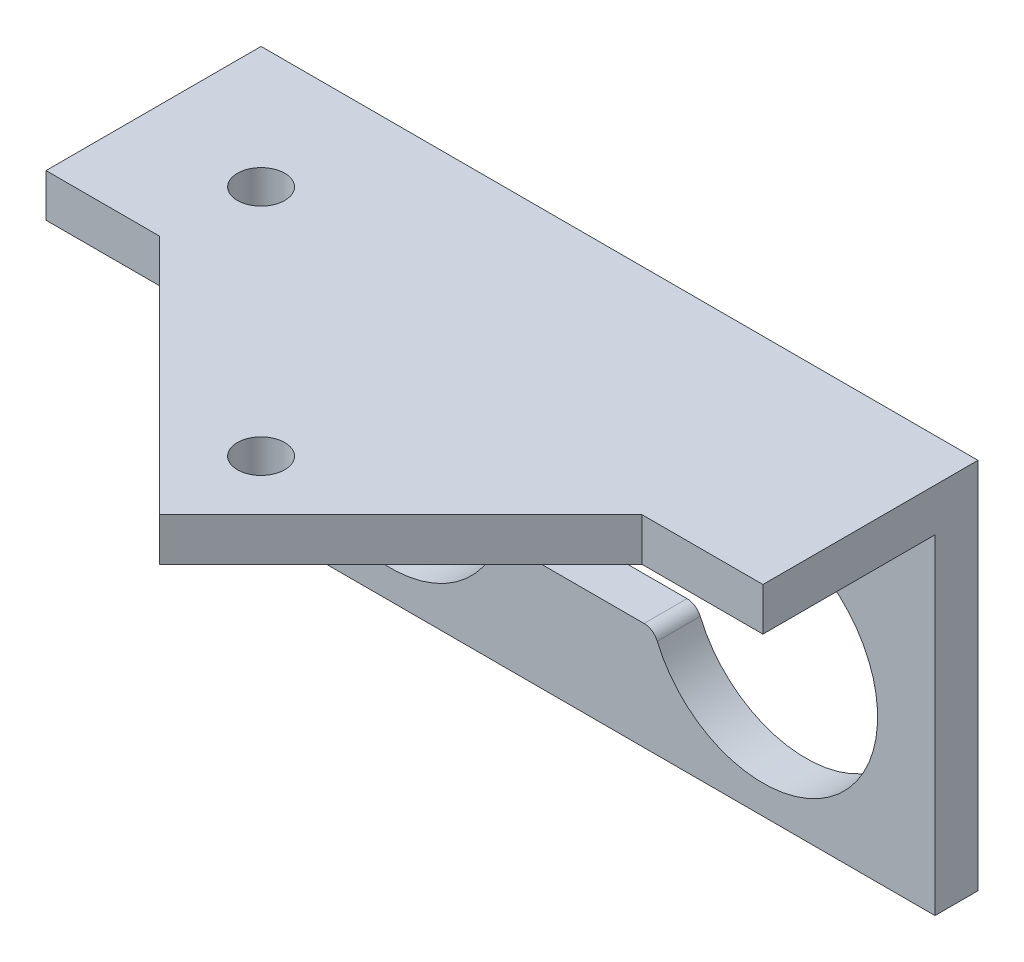
ISO-10303-21;
HEADER;
FILE_DESCRIPTION(('STEP AP214'),'2;1');
FILE_NAME('part.step','',(''),(''),'','','');
FILE_SCHEMA(('AUTOMOTIVE_DESIGN { 1 0 10303 214 1 1 1 1 }'));
ENDSEC;
DATA;
#1=APPLICATION_CONTEXT('core data for automotive mechanical design processes');
#2=APPLICATION_PROTOCOL_DEFINITION('international standard','automotive_design',2000,#1);
#3=PRODUCT_CONTEXT('',#1,'mechanical');
#4=PRODUCT('Part','Part','',(#3));
#5=PRODUCT_RELATED_PRODUCT_CATEGORY('part','',(#4));
#6=PRODUCT_DEFINITION_FORMATION('','',#4);
#7=PRODUCT_DEFINITION_CONTEXT('part definition',#1,'design');
#8=PRODUCT_DEFINITION('design','',#6,#7);
#9=PRODUCT_DEFINITION_SHAPE('','',#8);
#10=(LENGTH_UNIT() NAMED_UNIT(*) SI_UNIT(.MILLI.,.METRE.));
#11=(NAMED_UNIT(*) PLANE_ANGLE_UNIT() SI_UNIT($,.RADIAN.));
#12=(NAMED_UNIT(*) SI_UNIT($,.STERADIAN.) SOLID_ANGLE_UNIT());
#13=UNCERTAINTY_MEASURE_WITH_UNIT(LENGTH_MEASURE(1.E-05),#10,'distance_accuracy_value','');
#14=(GEOMETRIC_REPRESENTATION_CONTEXT(3) GLOBAL_UNCERTAINTY_ASSIGNED_CONTEXT((#13)) GLOBAL_UNIT_ASSIGNED_CONTEXT((#10,
#11,#12)) REPRESENTATION_CONTEXT('',''));
#15=CARTESIAN_POINT('',(0.,0.,0.));
#16=DIRECTION('',(0.,0.,1.));
#17=DIRECTION('',(1.,0.,0.));
#18=AXIS2_PLACEMENT_3D('',#15,#16,#17);
#19=CARTESIAN_POINT('',(-25.,16.,15.));
#20=DIRECTION('',(0.,0.,-1.));
#21=DIRECTION('',(-1.,0.,0.));
#22=AXIS2_PLACEMENT_3D('',#19,#20,#21);
#23=PLANE('',#22);
#24=DIRECTION('',(0.,1.,0.));
#25=VECTOR('',#24,1.);
#26=CARTESIAN_POINT('',(16.5685424949238,13.,15.));
#27=LINE('',#26,#25);
#28=CARTESIAN_POINT('',(16.5685424949238,13.,15.));
#29=VERTEX_POINT('',#28);
#30=CARTESIAN_POINT('',(16.5685424949238,16.,15.));
#31=VERTEX_POINT('',#30);
#32=EDGE_CURVE('E214',#29,#31,#27,.T.);
#33=ORIENTED_EDGE('',*,*,#32,.F.);
#34=DIRECTION('',(-1.,0.,0.));
#35=VECTOR('',#34,1.);
#36=CARTESIAN_POINT('',(25.,13.,15.));
#37=LINE('',#36,#35);
#38=CARTESIAN_POINT('',(25.,13.,15.));
#39=VERTEX_POINT('',#38);
#40=EDGE_CURVE('E208',#39,#29,#37,.T.);
#41=ORIENTED_EDGE('',*,*,#40,.F.);
#42=DIRECTION('',(0.,-1.,0.));
#43=VECTOR('',#42,1.);
#44=CARTESIAN_POINT('',(25.,16.,15.));
#45=LINE('',#44,#43);
#46=CARTESIAN_POINT('',(25.,16.,15.));
#47=VERTEX_POINT('',#46);
#48=EDGE_CURVE('E239',#47,#39,#45,.T.);
#49=ORIENTED_EDGE('',*,*,#48,.F.);
#50=DIRECTION('',(1.,0.,0.));
#51=VECTOR('',#50,1.);
#52=CARTESIAN_POINT('',(-25.,16.,15.));
#53=LINE('',#52,#51);
#54=EDGE_CURVE('E227',#31,#47,#53,.T.);
#55=ORIENTED_EDGE('',*,*,#54,.F.);
#56=EDGE_LOOP('',(#33,#41,#49,#55));
#57=FACE_BOUND('',#56,.T.);
#58=ADVANCED_FACE('F39',(#57),#23,.F.);
#59=CARTESIAN_POINT('',(-17.0710678118654,13.,14.9999999999999));
#60=VERTEX_POINT('',#59);
#61=CARTESIAN_POINT('',(-25.,13.,15.));
#62=VERTEX_POINT('',#61);
#63=EDGE_CURVE('E197',#60,#62,#37,.T.);
#64=ORIENTED_EDGE('',*,*,#63,.F.);
#65=DIRECTION('',(0.,1.,0.));
#66=VECTOR('',#65,1.);
#67=CARTESIAN_POINT('',(-17.0710678118654,13.,14.9999999999999));
#68=LINE('',#67,#66);
#69=CARTESIAN_POINT('',(-17.0710678118654,16.,15.));
#70=VERTEX_POINT('',#69);
#71=EDGE_CURVE('E181',#60,#70,#68,.T.);
#72=ORIENTED_EDGE('',*,*,#71,.T.);
#73=CARTESIAN_POINT('',(-25.,16.,15.));
#74=VERTEX_POINT('',#73);
#75=EDGE_CURVE('E228',#74,#70,#53,.T.);
#76=ORIENTED_EDGE('',*,*,#75,.F.);
#77=DIRECTION('',(0.,-1.,0.));
#78=VECTOR('',#77,1.);
#79=CARTESIAN_POINT('',(-25.,16.,15.));
#80=LINE('',#79,#78);
#81=EDGE_CURVE('E206',#74,#62,#80,.T.);
#82=ORIENTED_EDGE('',*,*,#81,.T.);
#83=EDGE_LOOP('',(#64,#72,#76,#82));
#84=FACE_BOUND('',#83,.T.);
#85=ADVANCED_FACE('F204',(#84),#23,.F.);
#86=CARTESIAN_POINT('',(0.,0.,3.));
#87=DIRECTION('',(0.,0.,1.));
#88=DIRECTION('',(1.,0.,0.));
#89=AXIS2_PLACEMENT_3D('',#86,#87,#88);
#90=PLANE('',#89);
#91=DIRECTION('',(0.,-1.,0.));
#92=VECTOR('',#91,1.);
#93=CARTESIAN_POINT('',(-25.,-10.,3.));
#94=LINE('',#93,#92);
#95=CARTESIAN_POINT('',(-25.,13.,3.));
#96=VERTEX_POINT('',#95);
#97=CARTESIAN_POINT('',(-25.,-10.,3.));
#98=VERTEX_POINT('',#97);
#99=EDGE_CURVE('E370',#96,#98,#94,.T.);
#100=ORIENTED_EDGE('',*,*,#99,.T.);
#101=DIRECTION('',(1.,0.,0.));
#102=VECTOR('',#101,1.);
#103=CARTESIAN_POINT('',(25.,-10.,3.));
#104=LINE('',#103,#102);
#105=CARTESIAN_POINT('',(25.,-10.,3.));
#106=VERTEX_POINT('',#105);
#107=EDGE_CURVE('E374',#98,#106,#104,.T.);
#108=ORIENTED_EDGE('',*,*,#107,.T.);
#109=DIRECTION('',(0.,1.,0.));
#110=VECTOR('',#109,1.);
#111=CARTESIAN_POINT('',(25.,-10.,3.));
#112=LINE('',#111,#110);
#113=CARTESIAN_POINT('',(25.,13.,3.));
#114=VERTEX_POINT('',#113);
#115=EDGE_CURVE('E378',#106,#114,#112,.T.);
#116=ORIENTED_EDGE('',*,*,#115,.T.);
#117=DIRECTION('',(1.,0.,0.));
#118=VECTOR('',#117,1.);
#119=CARTESIAN_POINT('',(25.,13.,3.));
#120=LINE('',#119,#118);
#121=EDGE_CURVE('E219',#96,#114,#120,.T.);
#122=ORIENTED_EDGE('',*,*,#121,.F.);
#123=EDGE_LOOP('',(#100,#108,#116,#122));
#124=FACE_BOUND('',#123,.T.);
#125=CARTESIAN_POINT('',(13.,0.,3.));
#126=DIRECTION('',(0.,0.,1.));
#127=DIRECTION('',(1.,0.,0.));
#128=AXIS2_PLACEMENT_3D('',#125,#126,#127);
#129=CIRCLE('',#128,8.);
#130=CARTESIAN_POINT('',(5.62972268809911,-3.11111111111111,3.));
#131=VERTEX_POINT('',#130);
#132=CARTESIAN_POINT('',(5.62972268809911,3.11111111111111,3.));
#133=VERTEX_POINT('',#132);
#134=EDGE_CURVE('E290',#131,#133,#129,.T.);
#135=ORIENTED_EDGE('',*,*,#134,.F.);
#136=CARTESIAN_POINT('',(4.7084380241115,-3.5,3.));
#137=DIRECTION('',(0.,0.,-1.));
#138=DIRECTION('',(-1.,0.,0.));
#139=AXIS2_PLACEMENT_3D('',#136,#137,#138);
#140=CIRCLE('',#139,1.);
#141=CARTESIAN_POINT('',(4.7084380241115,-2.5,3.));
#142=VERTEX_POINT('',#141);
#143=EDGE_CURVE('E287',#142,#131,#140,.T.);
#144=ORIENTED_EDGE('',*,*,#143,.F.);
#145=DIRECTION('',(1.,0.,0.));
#146=VECTOR('',#145,1.);
#147=CARTESIAN_POINT('',(4.7084380241115,-2.5,3.));
#148=LINE('',#147,#146);
#149=CARTESIAN_POINT('',(-4.7084380241115,-2.5,3.));
#150=VERTEX_POINT('',#149);
#151=EDGE_CURVE('E310',#150,#142,#148,.T.);
#152=ORIENTED_EDGE('',*,*,#151,.F.);
#153=CARTESIAN_POINT('',(-4.7084380241115,-3.5,3.));
#154=DIRECTION('',(0.,0.,-1.));
#155=DIRECTION('',(1.,0.,0.));
#156=AXIS2_PLACEMENT_3D('',#153,#154,#155);
#157=CIRCLE('',#156,1.);
#158=CARTESIAN_POINT('',(-5.62972268809911,-3.11111111111111,3.));
#159=VERTEX_POINT('',#158);
#160=EDGE_CURVE('E306',#159,#150,#157,.T.);
#161=ORIENTED_EDGE('',*,*,#160,.F.);
#162=CARTESIAN_POINT('',(-13.,0.,3.));
#163=DIRECTION('',(0.,0.,1.));
#164=DIRECTION('',(1.,0.,0.));
#165=AXIS2_PLACEMENT_3D('',#162,#163,#164);
#166=CIRCLE('',#165,8.);
#167=CARTESIAN_POINT('',(-5.62972268809911,3.11111111111111,3.));
#168=VERTEX_POINT('',#167);
#169=EDGE_CURVE('E303',#168,#159,#166,.T.);
#170=ORIENTED_EDGE('',*,*,#169,.F.);
#171=CARTESIAN_POINT('',(-4.7084380241115,3.5,3.));
#172=DIRECTION('',(0.,0.,-1.));
#173=DIRECTION('',(-1.,0.,0.));
#174=AXIS2_PLACEMENT_3D('',#171,#172,#173);
#175=CIRCLE('',#174,1.);
#176=CARTESIAN_POINT('',(-4.7084380241115,2.5,3.));
#177=VERTEX_POINT('',#176);
#178=EDGE_CURVE('E300',#177,#168,#175,.T.);
#179=ORIENTED_EDGE('',*,*,#178,.F.);
#180=DIRECTION('',(-1.,0.,0.));
#181=VECTOR('',#180,1.);
#182=CARTESIAN_POINT('',(-4.7084380241115,2.5,3.));
#183=LINE('',#182,#181);
#184=CARTESIAN_POINT('',(4.7084380241115,2.5,3.));
#185=VERTEX_POINT('',#184);
#186=EDGE_CURVE('E297',#185,#177,#183,.T.);
#187=ORIENTED_EDGE('',*,*,#186,.F.);
#188=CARTESIAN_POINT('',(4.7084380241115,3.5,3.));
#189=DIRECTION('',(0.,0.,-1.));
#190=DIRECTION('',(1.,0.,0.));
#191=AXIS2_PLACEMENT_3D('',#188,#189,#190);
#192=CIRCLE('',#191,1.);
#193=EDGE_CURVE('E294',#133,#185,#192,.T.);
#194=ORIENTED_EDGE('',*,*,#193,.F.);
#195=EDGE_LOOP('',(#135,#144,#152,#161,#170,#179,#187,#194));
#196=FACE_BOUND('',#195,.T.);
#197=DIRECTION('',(-1.,0.,0.));
#198=VECTOR('',#197,1.);
#199=CARTESIAN_POINT('',(3.25,9.,3.));
#200=LINE('',#199,#198);
#201=CARTESIAN_POINT('',(3.25,9.,3.));
#202=VERTEX_POINT('',#201);
#203=CARTESIAN_POINT('',(-3.25,9.,3.));
#204=VERTEX_POINT('',#203);
#205=EDGE_CURVE('E249',#202,#204,#200,.T.);
#206=ORIENTED_EDGE('',*,*,#205,.F.);
#207=CARTESIAN_POINT('',(3.25,7.25,3.));
#208=DIRECTION('',(0.,0.,1.));
#209=DIRECTION('',(1.,0.,0.));
#210=AXIS2_PLACEMENT_3D('',#207,#208,#209);
#211=CIRCLE('',#210,1.75);
#212=CARTESIAN_POINT('',(3.25,5.5,3.));
#213=VERTEX_POINT('',#212);
#214=EDGE_CURVE('E246',#213,#202,#211,.T.);
#215=ORIENTED_EDGE('',*,*,#214,.F.);
#216=DIRECTION('',(1.,0.,0.));
#217=VECTOR('',#216,1.);
#218=CARTESIAN_POINT('',(3.25,5.5,3.));
#219=LINE('',#218,#217);
#220=CARTESIAN_POINT('',(-3.25,5.5,3.));
#221=VERTEX_POINT('',#220);
#222=EDGE_CURVE('E256',#221,#213,#219,.T.);
#223=ORIENTED_EDGE('',*,*,#222,.F.);
#224=CARTESIAN_POINT('',(-3.25,7.25,3.));
#225=DIRECTION('',(0.,0.,1.));
#226=DIRECTION('',(1.,0.,0.));
#227=AXIS2_PLACEMENT_3D('',#224,#225,#226);
#228=CIRCLE('',#227,1.75);
#229=EDGE_CURVE('E253',#204,#221,#228,.T.);
#230=ORIENTED_EDGE('',*,*,#229,.F.);
#231=EDGE_LOOP('',(#206,#215,#223,#230));
#232=FACE_BOUND('',#231,.T.);
#233=ADVANCED_FACE('F410',(#124,#196,#232),#90,.T.);
#234=CARTESIAN_POINT('',(0.,0.,0.));
#235=DIRECTION('',(0.,0.,1.));
#236=DIRECTION('',(1.,0.,0.));
#237=AXIS2_PLACEMENT_3D('',#234,#235,#236);
#238=PLANE('',#237);
#239=CARTESIAN_POINT('',(4.7084380241115,-3.5,0.));
#240=DIRECTION('',(0.,0.,-1.));
#241=DIRECTION('',(-1.,0.,0.));
#242=AXIS2_PLACEMENT_3D('',#239,#240,#241);
#243=CIRCLE('',#242,1.);
#244=CARTESIAN_POINT('',(4.7084380241115,-2.5,0.));
#245=VERTEX_POINT('',#244);
#246=CARTESIAN_POINT('',(5.62972268809911,-3.11111111111111,0.));
#247=VERTEX_POINT('',#246);
#248=EDGE_CURVE('E286',#245,#247,#243,.T.);
#249=ORIENTED_EDGE('',*,*,#248,.T.);
#250=CARTESIAN_POINT('',(13.,0.,0.));
#251=DIRECTION('',(0.,0.,1.));
#252=DIRECTION('',(1.,0.,0.));
#253=AXIS2_PLACEMENT_3D('',#250,#251,#252);
#254=CIRCLE('',#253,8.);
#255=CARTESIAN_POINT('',(5.62972268809911,3.11111111111111,0.));
#256=VERTEX_POINT('',#255);
#257=EDGE_CURVE('E317',#247,#256,#254,.T.);
#258=ORIENTED_EDGE('',*,*,#257,.T.);
#259=CARTESIAN_POINT('',(4.7084380241115,3.5,0.));
#260=DIRECTION('',(0.,0.,-1.));
#261=DIRECTION('',(1.,0.,0.));
#262=AXIS2_PLACEMENT_3D('',#259,#260,#261);
#263=CIRCLE('',#262,1.);
#264=CARTESIAN_POINT('',(4.7084380241115,2.5,0.));
#265=VERTEX_POINT('',#264);
#266=EDGE_CURVE('E321',#256,#265,#263,.T.);
#267=ORIENTED_EDGE('',*,*,#266,.T.);
#268=DIRECTION('',(-1.,0.,0.));
#269=VECTOR('',#268,1.);
#270=CARTESIAN_POINT('',(-4.7084380241115,2.5,0.));
#271=LINE('',#270,#269);
#272=CARTESIAN_POINT('',(-4.7084380241115,2.5,0.));
#273=VERTEX_POINT('',#272);
#274=EDGE_CURVE('E325',#265,#273,#271,.T.);
#275=ORIENTED_EDGE('',*,*,#274,.T.);
#276=CARTESIAN_POINT('',(-4.7084380241115,3.5,0.));
#277=DIRECTION('',(0.,0.,-1.));
#278=DIRECTION('',(-1.,0.,0.));
#279=AXIS2_PLACEMENT_3D('',#276,#277,#278);
#280=CIRCLE('',#279,1.);
#281=CARTESIAN_POINT('',(-5.62972268809911,3.11111111111111,0.));
#282=VERTEX_POINT('',#281);
#283=EDGE_CURVE('E329',#273,#282,#280,.T.);
#284=ORIENTED_EDGE('',*,*,#283,.T.);
#285=CARTESIAN_POINT('',(-13.,0.,0.));
#286=DIRECTION('',(0.,0.,1.));
#287=DIRECTION('',(1.,0.,0.));
#288=AXIS2_PLACEMENT_3D('',#285,#286,#287);
#289=CIRCLE('',#288,8.);
#290=CARTESIAN_POINT('',(-5.62972268809911,-3.11111111111111,0.));
#291=VERTEX_POINT('',#290);
#292=EDGE_CURVE('E333',#282,#291,#289,.T.);
#293=ORIENTED_EDGE('',*,*,#292,.T.);
#294=CARTESIAN_POINT('',(-4.7084380241115,-3.5,0.));
#295=DIRECTION('',(0.,0.,-1.));
#296=DIRECTION('',(1.,0.,0.));
#297=AXIS2_PLACEMENT_3D('',#294,#295,#296);
#298=CIRCLE('',#297,1.);
#299=CARTESIAN_POINT('',(-4.7084380241115,-2.5,0.));
#300=VERTEX_POINT('',#299);
#301=EDGE_CURVE('E337',#291,#300,#298,.T.);
#302=ORIENTED_EDGE('',*,*,#301,.T.);
#303=DIRECTION('',(1.,0.,0.));
#304=VECTOR('',#303,1.);
#305=CARTESIAN_POINT('',(4.7084380241115,-2.5,0.));
#306=LINE('',#305,#304);
#307=EDGE_CURVE('E291',#300,#245,#306,.T.);
#308=ORIENTED_EDGE('',*,*,#307,.T.);
#309=EDGE_LOOP('',(#249,#258,#267,#275,#284,#293,#302,#308));
#310=FACE_BOUND('',#309,.T.);
#311=DIRECTION('',(0.,-1.,0.));
#312=VECTOR('',#311,1.);
#313=CARTESIAN_POINT('',(-25.,-10.,0.));
#314=LINE('',#313,#312);
#315=CARTESIAN_POINT('',(-25.,16.,0.));
#316=VERTEX_POINT('',#315);
#317=CARTESIAN_POINT('',(-25.,-10.,0.));
#318=VERTEX_POINT('',#317);
#319=EDGE_CURVE('E369',#316,#318,#314,.T.);
#320=ORIENTED_EDGE('',*,*,#319,.F.);
#321=DIRECTION('',(-1.,0.,0.));
#322=VECTOR('',#321,1.);
#323=CARTESIAN_POINT('',(-25.,16.,0.));
#324=LINE('',#323,#322);
#325=CARTESIAN_POINT('',(25.,16.,0.));
#326=VERTEX_POINT('',#325);
#327=EDGE_CURVE('E235',#326,#316,#324,.T.);
#328=ORIENTED_EDGE('',*,*,#327,.F.);
#329=DIRECTION('',(0.,1.,0.));
#330=VECTOR('',#329,1.);
#331=CARTESIAN_POINT('',(25.,-10.,0.));
#332=LINE('',#331,#330);
#333=CARTESIAN_POINT('',(25.,-10.,0.));
#334=VERTEX_POINT('',#333);
#335=EDGE_CURVE('E375',#334,#326,#332,.T.);
#336=ORIENTED_EDGE('',*,*,#335,.F.);
#337=DIRECTION('',(1.,0.,0.));
#338=VECTOR('',#337,1.);
#339=CARTESIAN_POINT('',(25.,-10.,0.));
#340=LINE('',#339,#338);
#341=EDGE_CURVE('E384',#318,#334,#340,.T.);
#342=ORIENTED_EDGE('',*,*,#341,.F.);
#343=EDGE_LOOP('',(#320,#328,#336,#342));
#344=FACE_BOUND('',#343,.T.);
#345=CARTESIAN_POINT('',(3.25,7.25,0.));
#346=DIRECTION('',(0.,0.,1.));
#347=DIRECTION('',(1.,0.,0.));
#348=AXIS2_PLACEMENT_3D('',#345,#346,#347);
#349=CIRCLE('',#348,1.75);
#350=CARTESIAN_POINT('',(3.25,5.5,0.));
#351=VERTEX_POINT('',#350);
#352=CARTESIAN_POINT('',(3.25,9.,0.));
#353=VERTEX_POINT('',#352);
#354=EDGE_CURVE('E245',#351,#353,#349,.T.);
#355=ORIENTED_EDGE('',*,*,#354,.T.);
#356=DIRECTION('',(-1.,0.,0.));
#357=VECTOR('',#356,1.);
#358=CARTESIAN_POINT('',(3.25,9.,0.));
#359=LINE('',#358,#357);
#360=CARTESIAN_POINT('',(-3.25,9.,0.));
#361=VERTEX_POINT('',#360);
#362=EDGE_CURVE('E263',#353,#361,#359,.T.);
#363=ORIENTED_EDGE('',*,*,#362,.T.);
#364=CARTESIAN_POINT('',(-3.25,7.25,0.));
#365=DIRECTION('',(0.,0.,1.));
#366=DIRECTION('',(1.,0.,0.));
#367=AXIS2_PLACEMENT_3D('',#364,#365,#366);
#368=CIRCLE('',#367,1.75);
#369=CARTESIAN_POINT('',(-3.25,5.5,0.));
#370=VERTEX_POINT('',#369);
#371=EDGE_CURVE('E267',#361,#370,#368,.T.);
#372=ORIENTED_EDGE('',*,*,#371,.T.);
#373=DIRECTION('',(1.,0.,0.));
#374=VECTOR('',#373,1.);
#375=CARTESIAN_POINT('',(3.25,5.5,0.));
#376=LINE('',#375,#374);
#377=EDGE_CURVE('E250',#370,#351,#376,.T.);
#378=ORIENTED_EDGE('',*,*,#377,.T.);
#379=EDGE_LOOP('',(#355,#363,#372,#378));
#380=FACE_BOUND('',#379,.T.);
#381=ADVANCED_FACE('F400',(#310,#344,#380),#238,.F.);
#382=CARTESIAN_POINT('',(-25.,-10.,3.));
#383=DIRECTION('',(1.,0.,0.));
#384=DIRECTION('',(0.,0.,-1.));
#385=AXIS2_PLACEMENT_3D('',#382,#383,#384);
#386=PLANE('',#385);
#387=ORIENTED_EDGE('',*,*,#99,.F.);
#388=DIRECTION('',(0.,0.,-1.));
#389=VECTOR('',#388,1.);
#390=CARTESIAN_POINT('',(-25.,13.,3.));
#391=LINE('',#390,#389);
#392=EDGE_CURVE('E213',#62,#96,#391,.T.);
#393=ORIENTED_EDGE('',*,*,#392,.F.);
#394=ORIENTED_EDGE('',*,*,#81,.F.);
#395=DIRECTION('',(0.,0.,1.));
#396=VECTOR('',#395,1.);
#397=CARTESIAN_POINT('',(-25.,16.,0.));
#398=LINE('',#397,#396);
#399=EDGE_CURVE('E223',#316,#74,#398,.T.);
#400=ORIENTED_EDGE('',*,*,#399,.F.);
#401=ORIENTED_EDGE('',*,*,#319,.T.);
#402=DIRECTION('',(0.,0.,-1.));
#403=VECTOR('',#402,1.);
#404=CARTESIAN_POINT('',(-25.,-10.,3.));
#405=LINE('',#404,#403);
#406=EDGE_CURVE('E11',#98,#318,#405,.T.);
#407=ORIENTED_EDGE('',*,*,#406,.F.);
#408=EDGE_LOOP('',(#387,#393,#394,#400,#401,#407));
#409=FACE_BOUND('',#408,.T.);
#410=ADVANCED_FACE('F41',(#409),#386,.F.);
#411=CARTESIAN_POINT('',(25.,-10.,3.));
#412=DIRECTION('',(0.,1.,0.));
#413=DIRECTION('',(-1.,0.,0.));
#414=AXIS2_PLACEMENT_3D('',#411,#412,#413);
#415=PLANE('',#414);
#416=ORIENTED_EDGE('',*,*,#341,.T.);
#417=DIRECTION('',(0.,0.,-1.));
#418=VECTOR('',#417,1.);
#419=CARTESIAN_POINT('',(25.,-10.,3.));
#420=LINE('',#419,#418);
#421=EDGE_CURVE('E48',#106,#334,#420,.T.);
#422=ORIENTED_EDGE('',*,*,#421,.F.);
#423=ORIENTED_EDGE('',*,*,#107,.F.);
#424=ORIENTED_EDGE('',*,*,#406,.T.);
#425=EDGE_LOOP('',(#416,#422,#423,#424));
#426=FACE_BOUND('',#425,.T.);
#427=ADVANCED_FACE('F412',(#426),#415,.F.);
#428=CARTESIAN_POINT('',(25.,-10.,3.));
#429=DIRECTION('',(-1.,0.,0.));
#430=DIRECTION('',(0.,0.,1.));
#431=AXIS2_PLACEMENT_3D('',#428,#429,#430);
#432=PLANE('',#431);
#433=DIRECTION('',(0.,0.,1.));
#434=VECTOR('',#433,1.);
#435=CARTESIAN_POINT('',(25.,13.,3.));
#436=LINE('',#435,#434);
#437=EDGE_CURVE('E209',#114,#39,#436,.T.);
#438=ORIENTED_EDGE('',*,*,#437,.F.);
#439=ORIENTED_EDGE('',*,*,#115,.F.);
#440=ORIENTED_EDGE('',*,*,#421,.T.);
#441=ORIENTED_EDGE('',*,*,#335,.T.);
#442=DIRECTION('',(0.,0.,-1.));
#443=VECTOR('',#442,1.);
#444=CARTESIAN_POINT('',(25.,16.,0.));
#445=LINE('',#444,#443);
#446=EDGE_CURVE('E231',#47,#326,#445,.T.);
#447=ORIENTED_EDGE('',*,*,#446,.F.);
#448=ORIENTED_EDGE('',*,*,#48,.T.);
#449=EDGE_LOOP('',(#438,#439,#440,#441,#447,#448));
#450=FACE_BOUND('',#449,.T.);
#451=ADVANCED_FACE('F395',(#450),#432,.F.);
#452=CARTESIAN_POINT('',(4.7084380241115,-3.5,3.));
#453=DIRECTION('',(0.,0.,-1.));
#454=DIRECTION('',(-1.,0.,0.));
#455=AXIS2_PLACEMENT_3D('',#452,#453,#454);
#456=CYLINDRICAL_SURFACE('',#455,1.);
#457=ORIENTED_EDGE('',*,*,#248,.F.);
#458=DIRECTION('',(0.,0.,-1.));
#459=VECTOR('',#458,1.);
#460=CARTESIAN_POINT('',(4.7084380241115,-2.5,3.));
#461=LINE('',#460,#459);
#462=EDGE_CURVE('E313',#142,#245,#461,.T.);
#463=ORIENTED_EDGE('',*,*,#462,.F.);
#464=ORIENTED_EDGE('',*,*,#143,.T.);
#465=DIRECTION('',(0.,0.,-1.));
#466=VECTOR('',#465,1.);
#467=CARTESIAN_POINT('',(5.62972268809911,-3.11111111111111,3.));
#468=LINE('',#467,#466);
#469=EDGE_CURVE('E365',#131,#247,#468,.T.);
#470=ORIENTED_EDGE('',*,*,#469,.T.);
#471=EDGE_LOOP('',(#457,#463,#464,#470));
#472=FACE_BOUND('',#471,.T.);
#473=ADVANCED_FACE('F418',(#472),#456,.T.);
#474=CARTESIAN_POINT('',(13.,0.,3.));
#475=DIRECTION('',(0.,0.,-1.));
#476=DIRECTION('',(-1.,0.,0.));
#477=AXIS2_PLACEMENT_3D('',#474,#475,#476);
#478=CYLINDRICAL_SURFACE('',#477,8.);
#479=ORIENTED_EDGE('',*,*,#257,.F.);
#480=ORIENTED_EDGE('',*,*,#469,.F.);
#481=ORIENTED_EDGE('',*,*,#134,.T.);
#482=DIRECTION('',(0.,0.,-1.));
#483=VECTOR('',#482,1.);
#484=CARTESIAN_POINT('',(5.62972268809911,3.11111111111111,3.));
#485=LINE('',#484,#483);
#486=EDGE_CURVE('E362',#133,#256,#485,.T.);
#487=ORIENTED_EDGE('',*,*,#486,.T.);
#488=EDGE_LOOP('',(#479,#480,#481,#487));
#489=FACE_BOUND('',#488,.T.);
#490=ADVANCED_FACE('F469',(#489),#478,.F.);
#491=CARTESIAN_POINT('',(4.7084380241115,3.5,3.));
#492=DIRECTION('',(0.,0.,-1.));
#493=DIRECTION('',(-1.,0.,0.));
#494=AXIS2_PLACEMENT_3D('',#491,#492,#493);
#495=CYLINDRICAL_SURFACE('',#494,1.);
#496=ORIENTED_EDGE('',*,*,#266,.F.);
#497=ORIENTED_EDGE('',*,*,#486,.F.);
#498=ORIENTED_EDGE('',*,*,#193,.T.);
#499=DIRECTION('',(0.,0.,-1.));
#500=VECTOR('',#499,1.);
#501=CARTESIAN_POINT('',(4.7084380241115,2.5,3.));
#502=LINE('',#501,#500);
#503=EDGE_CURVE('E359',#185,#265,#502,.T.);
#504=ORIENTED_EDGE('',*,*,#503,.T.);
#505=EDGE_LOOP('',(#496,#497,#498,#504));
#506=FACE_BOUND('',#505,.T.);
#507=ADVANCED_FACE('F465',(#506),#495,.T.);
#508=CARTESIAN_POINT('',(-4.7084380241115,2.5,3.));
#509=DIRECTION('',(0.,-1.,0.));
#510=DIRECTION('',(0.,0.,-1.));
#511=AXIS2_PLACEMENT_3D('',#508,#509,#510);
#512=PLANE('',#511);
#513=ORIENTED_EDGE('',*,*,#274,.F.);
#514=ORIENTED_EDGE('',*,*,#503,.F.);
#515=ORIENTED_EDGE('',*,*,#186,.T.);
#516=DIRECTION('',(0.,0.,-1.));
#517=VECTOR('',#516,1.);
#518=CARTESIAN_POINT('',(-4.7084380241115,2.5,3.));
#519=LINE('',#518,#517);
#520=EDGE_CURVE('E356',#177,#273,#519,.T.);
#521=ORIENTED_EDGE('',*,*,#520,.T.);
#522=EDGE_LOOP('',(#513,#514,#515,#521));
#523=FACE_BOUND('',#522,.T.);
#524=ADVANCED_FACE('F461',(#523),#512,.T.);
#525=CARTESIAN_POINT('',(-4.7084380241115,3.5,3.));
#526=DIRECTION('',(0.,0.,-1.));
#527=DIRECTION('',(-1.,0.,0.));
#528=AXIS2_PLACEMENT_3D('',#525,#526,#527);
#529=CYLINDRICAL_SURFACE('',#528,1.);
#530=ORIENTED_EDGE('',*,*,#283,.F.);
#531=ORIENTED_EDGE('',*,*,#520,.F.);
#532=ORIENTED_EDGE('',*,*,#178,.T.);
#533=DIRECTION('',(0.,0.,-1.));
#534=VECTOR('',#533,1.);
#535=CARTESIAN_POINT('',(-5.62972268809911,3.11111111111111,3.));
#536=LINE('',#535,#534);
#537=EDGE_CURVE('E353',#168,#282,#536,.T.);
#538=ORIENTED_EDGE('',*,*,#537,.T.);
#539=EDGE_LOOP('',(#530,#531,#532,#538));
#540=FACE_BOUND('',#539,.T.);
#541=ADVANCED_FACE('F457',(#540),#529,.T.);
#542=CARTESIAN_POINT('',(-13.,0.,3.));
#543=DIRECTION('',(0.,0.,-1.));
#544=DIRECTION('',(-1.,0.,0.));
#545=AXIS2_PLACEMENT_3D('',#542,#543,#544);
#546=CYLINDRICAL_SURFACE('',#545,8.);
#547=ORIENTED_EDGE('',*,*,#292,.F.);
#548=ORIENTED_EDGE('',*,*,#537,.F.);
#549=ORIENTED_EDGE('',*,*,#169,.T.);
#550=DIRECTION('',(0.,0.,-1.));
#551=VECTOR('',#550,1.);
#552=CARTESIAN_POINT('',(-5.62972268809911,-3.11111111111111,3.));
#553=LINE('',#552,#551);
#554=EDGE_CURVE('E350',#159,#291,#553,.T.);
#555=ORIENTED_EDGE('',*,*,#554,.T.);
#556=EDGE_LOOP('',(#547,#548,#549,#555));
#557=FACE_BOUND('',#556,.T.);
#558=ADVANCED_FACE('F453',(#557),#546,.F.);
#559=CARTESIAN_POINT('',(-4.7084380241115,-3.5,3.));
#560=DIRECTION('',(0.,0.,-1.));
#561=DIRECTION('',(-1.,0.,0.));
#562=AXIS2_PLACEMENT_3D('',#559,#560,#561);
#563=CYLINDRICAL_SURFACE('',#562,1.);
#564=ORIENTED_EDGE('',*,*,#301,.F.);
#565=ORIENTED_EDGE('',*,*,#554,.F.);
#566=ORIENTED_EDGE('',*,*,#160,.T.);
#567=DIRECTION('',(0.,0.,-1.));
#568=VECTOR('',#567,1.);
#569=CARTESIAN_POINT('',(-4.7084380241115,-2.5,3.));
#570=LINE('',#569,#568);
#571=EDGE_CURVE('E347',#150,#300,#570,.T.);
#572=ORIENTED_EDGE('',*,*,#571,.T.);
#573=EDGE_LOOP('',(#564,#565,#566,#572));
#574=FACE_BOUND('',#573,.T.);
#575=ADVANCED_FACE('F449',(#574),#563,.T.);
#576=CARTESIAN_POINT('',(4.7084380241115,-2.5,3.));
#577=DIRECTION('',(0.,1.,0.));
#578=DIRECTION('',(-1.,0.,0.));
#579=AXIS2_PLACEMENT_3D('',#576,#577,#578);
#580=PLANE('',#579);
#581=ORIENTED_EDGE('',*,*,#307,.F.);
#582=ORIENTED_EDGE('',*,*,#571,.F.);
#583=ORIENTED_EDGE('',*,*,#151,.T.);
#584=ORIENTED_EDGE('',*,*,#462,.T.);
#585=EDGE_LOOP('',(#581,#582,#583,#584));
#586=FACE_BOUND('',#585,.T.);
#587=ADVANCED_FACE('F445',(#586),#580,.T.);
#588=CARTESIAN_POINT('',(3.25,7.25,3.));
#589=DIRECTION('',(0.,0.,-1.));
#590=DIRECTION('',(-1.,0.,0.));
#591=AXIS2_PLACEMENT_3D('',#588,#589,#590);
#592=CYLINDRICAL_SURFACE('',#591,1.75);
#593=ORIENTED_EDGE('',*,*,#354,.F.);
#594=DIRECTION('',(0.,0.,-1.));
#595=VECTOR('',#594,1.);
#596=CARTESIAN_POINT('',(3.25,5.5,3.));
#597=LINE('',#596,#595);
#598=EDGE_CURVE('E259',#213,#351,#597,.T.);
#599=ORIENTED_EDGE('',*,*,#598,.F.);
#600=ORIENTED_EDGE('',*,*,#214,.T.);
#601=DIRECTION('',(0.,0.,-1.));
#602=VECTOR('',#601,1.);
#603=CARTESIAN_POINT('',(3.25,9.,3.));
#604=LINE('',#603,#602);
#605=EDGE_CURVE('E282',#202,#353,#604,.T.);
#606=ORIENTED_EDGE('',*,*,#605,.T.);
#607=EDGE_LOOP('',(#593,#599,#600,#606));
#608=FACE_BOUND('',#607,.T.);
#609=ADVANCED_FACE('F441',(#608),#592,.F.);
#610=CARTESIAN_POINT('',(3.25,9.,3.));
#611=DIRECTION('',(0.,-1.,0.));
#612=DIRECTION('',(1.,0.,0.));
#613=AXIS2_PLACEMENT_3D('',#610,#611,#612);
#614=PLANE('',#613);
#615=ORIENTED_EDGE('',*,*,#362,.F.);
#616=ORIENTED_EDGE('',*,*,#605,.F.);
#617=ORIENTED_EDGE('',*,*,#205,.T.);
#618=DIRECTION('',(0.,0.,-1.));
#619=VECTOR('',#618,1.);
#620=CARTESIAN_POINT('',(-3.25,9.,3.));
#621=LINE('',#620,#619);
#622=EDGE_CURVE('E279',#204,#361,#621,.T.);
#623=ORIENTED_EDGE('',*,*,#622,.T.);
#624=EDGE_LOOP('',(#615,#616,#617,#623));
#625=FACE_BOUND('',#624,.T.);
#626=ADVANCED_FACE('F437',(#625),#614,.T.);
#627=CARTESIAN_POINT('',(-3.25,7.25,3.));
#628=DIRECTION('',(0.,0.,-1.));
#629=DIRECTION('',(-1.,0.,0.));
#630=AXIS2_PLACEMENT_3D('',#627,#628,#629);
#631=CYLINDRICAL_SURFACE('',#630,1.75);
#632=ORIENTED_EDGE('',*,*,#371,.F.);
#633=ORIENTED_EDGE('',*,*,#622,.F.);
#634=ORIENTED_EDGE('',*,*,#229,.T.);
#635=DIRECTION('',(0.,0.,-1.));
#636=VECTOR('',#635,1.);
#637=CARTESIAN_POINT('',(-3.25,5.5,3.));
#638=LINE('',#637,#636);
#639=EDGE_CURVE('E63',#221,#370,#638,.T.);
#640=ORIENTED_EDGE('',*,*,#639,.T.);
#641=EDGE_LOOP('',(#632,#633,#634,#640));
#642=FACE_BOUND('',#641,.T.);
#643=ADVANCED_FACE('F434',(#642),#631,.F.);
#644=CARTESIAN_POINT('',(3.25,5.5,3.));
#645=DIRECTION('',(0.,1.,0.));
#646=DIRECTION('',(0.,0.,1.));
#647=AXIS2_PLACEMENT_3D('',#644,#645,#646);
#648=PLANE('',#647);
#649=ORIENTED_EDGE('',*,*,#377,.F.);
#650=ORIENTED_EDGE('',*,*,#639,.F.);
#651=ORIENTED_EDGE('',*,*,#222,.T.);
#652=ORIENTED_EDGE('',*,*,#598,.T.);
#653=EDGE_LOOP('',(#649,#650,#651,#652));
#654=FACE_BOUND('',#653,.T.);
#655=ADVANCED_FACE('F431',(#654),#648,.T.);
#656=CARTESIAN_POINT('',(0.,16.,0.));
#657=DIRECTION('',(0.,1.,0.));
#658=DIRECTION('',(-1.,0.,0.));
#659=AXIS2_PLACEMENT_3D('',#656,#657,#658);
#660=PLANE('',#659);
#661=CARTESIAN_POINT('',(-16.5147186257614,16.,8.48528137423857));
#662=DIRECTION('',(0.,1.,0.));
#663=DIRECTION('',(-1.,0.,0.));
#664=AXIS2_PLACEMENT_3D('',#661,#662,#663);
#665=CIRCLE('',#664,1.65);
#666=CARTESIAN_POINT('',(-18.1647186257614,16.,8.48528137423857));
#667=VERTEX_POINT('',#666);
#668=EDGE_CURVE('E698',#667,#667,#665,.T.);
#669=ORIENTED_EDGE('',*,*,#668,.F.);
#670=EDGE_LOOP('',(#669));
#671=FACE_BOUND('',#670,.T.);
#672=ORIENTED_EDGE('',*,*,#399,.T.);
#673=ORIENTED_EDGE('',*,*,#75,.T.);
#674=DIRECTION('',(0.707106781186546,0.,0.707106781186549));
#675=VECTOR('',#674,1.);
#676=CARTESIAN_POINT('',(-0.251262658470827,16.,31.8198051533946));
#677=LINE('',#676,#675);
#678=CARTESIAN_POINT('',(-0.251262658470827,16.,31.8198051533946));
#679=VERTEX_POINT('',#678);
#680=EDGE_CURVE('E55',#70,#679,#677,.T.);
#681=ORIENTED_EDGE('',*,*,#680,.T.);
#682=DIRECTION('',(0.707106781186547,0.,-0.707106781186547));
#683=VECTOR('',#682,1.);
#684=CARTESIAN_POINT('',(-0.251262658470827,16.,31.8198051533946));
#685=LINE('',#684,#683);
#686=EDGE_CURVE('E201',#679,#31,#685,.T.);
#687=ORIENTED_EDGE('',*,*,#686,.T.);
#688=ORIENTED_EDGE('',*,*,#54,.T.);
#689=ORIENTED_EDGE('',*,*,#446,.T.);
#690=ORIENTED_EDGE('',*,*,#327,.T.);
#691=EDGE_LOOP('',(#672,#673,#681,#687,#688,#689,#690));
#692=FACE_BOUND('',#691,.T.);
#693=CARTESIAN_POINT('',(-0.251262658470774,16.,24.7487373415291));
#694=DIRECTION('',(0.,1.,0.));
#695=DIRECTION('',(-1.,0.,0.));
#696=AXIS2_PLACEMENT_3D('',#693,#694,#695);
#697=CIRCLE('',#696,1.65);
#698=CARTESIAN_POINT('',(-1.90126265847077,16.,24.7487373415291));
#699=VERTEX_POINT('',#698);
#700=EDGE_CURVE('E702',#699,#699,#697,.T.);
#701=ORIENTED_EDGE('',*,*,#700,.F.);
#702=EDGE_LOOP('',(#701));
#703=FACE_BOUND('',#702,.T.);
#704=ADVANCED_FACE('F404',(#671,#692,#703),#660,.T.);
#705=CARTESIAN_POINT('',(0.,13.,0.));
#706=DIRECTION('',(0.,-1.,0.));
#707=DIRECTION('',(1.,0.,0.));
#708=AXIS2_PLACEMENT_3D('',#705,#706,#707);
#709=PLANE('',#708);
#710=CARTESIAN_POINT('',(-16.5147186257614,13.,8.48528137423857));
#711=DIRECTION('',(0.,1.,0.));
#712=DIRECTION('',(-1.,0.,0.));
#713=AXIS2_PLACEMENT_3D('',#710,#711,#712);
#714=CIRCLE('',#713,1.65);
#715=CARTESIAN_POINT('',(-18.1647186257614,13.,8.48528137423857));
#716=VERTEX_POINT('',#715);
#717=EDGE_CURVE('E695',#716,#716,#714,.T.);
#718=ORIENTED_EDGE('',*,*,#717,.T.);
#719=EDGE_LOOP('',(#718));
#720=FACE_BOUND('',#719,.T.);
#721=ORIENTED_EDGE('',*,*,#437,.T.);
#722=ORIENTED_EDGE('',*,*,#40,.T.);
#723=DIRECTION('',(0.707106781186547,0.,-0.707106781186547));
#724=VECTOR('',#723,1.);
#725=CARTESIAN_POINT('',(-0.251262658470826,13.,31.8198051533946));
#726=LINE('',#725,#724);
#727=CARTESIAN_POINT('',(-0.251262658470826,13.,31.8198051533946));
#728=VERTEX_POINT('',#727);
#729=EDGE_CURVE('E191',#728,#29,#726,.T.);
#730=ORIENTED_EDGE('',*,*,#729,.F.);
#731=DIRECTION('',(0.707106781186546,0.,0.707106781186549));
#732=VECTOR('',#731,1.);
#733=CARTESIAN_POINT('',(-0.251262658470826,13.,31.8198051533946));
#734=LINE('',#733,#732);
#735=EDGE_CURVE('E184',#60,#728,#734,.T.);
#736=ORIENTED_EDGE('',*,*,#735,.F.);
#737=ORIENTED_EDGE('',*,*,#63,.T.);
#738=ORIENTED_EDGE('',*,*,#392,.T.);
#739=ORIENTED_EDGE('',*,*,#121,.T.);
#740=EDGE_LOOP('',(#721,#722,#730,#736,#737,#738,#739));
#741=FACE_BOUND('',#740,.T.);
#742=CARTESIAN_POINT('',(-0.251262658470774,13.,24.7487373415291));
#743=DIRECTION('',(0.,1.,0.));
#744=DIRECTION('',(-1.,0.,0.));
#745=AXIS2_PLACEMENT_3D('',#742,#743,#744);
#746=CIRCLE('',#745,1.65);
#747=CARTESIAN_POINT('',(-1.90126265847077,13.,24.7487373415291));
#748=VERTEX_POINT('',#747);
#749=EDGE_CURVE('E705',#748,#748,#746,.T.);
#750=ORIENTED_EDGE('',*,*,#749,.T.);
#751=EDGE_LOOP('',(#750));
#752=FACE_BOUND('',#751,.T.);
#753=ADVANCED_FACE('F194',(#720,#741,#752),#709,.T.);
#754=CARTESIAN_POINT('',(-0.251262658470826,13.,31.8198051533946));
#755=DIRECTION('',(0.707106781186548,0.,0.707106781186548));
#756=DIRECTION('',(0.707106781186548,0.,-0.707106781186548));
#757=AXIS2_PLACEMENT_3D('',#754,#755,#756);
#758=PLANE('',#757);
#759=ORIENTED_EDGE('',*,*,#686,.F.);
#760=DIRECTION('',(0.,1.,0.));
#761=VECTOR('',#760,1.);
#762=CARTESIAN_POINT('',(-0.251262658470826,13.,31.8198051533946));
#763=LINE('',#762,#761);
#764=EDGE_CURVE('E190',#728,#679,#763,.T.);
#765=ORIENTED_EDGE('',*,*,#764,.F.);
#766=ORIENTED_EDGE('',*,*,#729,.T.);
#767=ORIENTED_EDGE('',*,*,#32,.T.);
#768=EDGE_LOOP('',(#759,#765,#766,#767));
#769=FACE_BOUND('',#768,.T.);
#770=ADVANCED_FACE('F598',(#769),#758,.T.);
#771=CARTESIAN_POINT('',(-0.251262658470826,13.,31.8198051533946));
#772=DIRECTION('',(-0.707106781186549,0.,0.707106781186546));
#773=DIRECTION('',(0.707106781186546,0.,0.707106781186549));
#774=AXIS2_PLACEMENT_3D('',#771,#772,#773);
#775=PLANE('',#774);
#776=ORIENTED_EDGE('',*,*,#680,.F.);
#777=ORIENTED_EDGE('',*,*,#71,.F.);
#778=ORIENTED_EDGE('',*,*,#735,.T.);
#779=ORIENTED_EDGE('',*,*,#764,.T.);
#780=EDGE_LOOP('',(#776,#777,#778,#779));
#781=FACE_BOUND('',#780,.T.);
#782=ADVANCED_FACE('F183',(#781),#775,.T.);
#783=CARTESIAN_POINT('',(-0.251262658470774,13.,24.7487373415291));
#784=DIRECTION('',(0.,1.,0.));
#785=DIRECTION('',(-1.,0.,0.));
#786=AXIS2_PLACEMENT_3D('',#783,#784,#785);
#787=CYLINDRICAL_SURFACE('',#786,1.65);
#788=ORIENTED_EDGE('',*,*,#749,.F.);
#789=EDGE_LOOP('',(#788));
#790=FACE_BOUND('',#789,.T.);
#791=ORIENTED_EDGE('',*,*,#700,.T.);
#792=EDGE_LOOP('',(#791));
#793=FACE_BOUND('',#792,.T.);
#794=ADVANCED_FACE('F613',(#790,#793),#787,.F.);
#795=CARTESIAN_POINT('',(-16.5147186257614,13.,8.48528137423857));
#796=DIRECTION('',(0.,1.,0.));
#797=DIRECTION('',(-1.,0.,0.));
#798=AXIS2_PLACEMENT_3D('',#795,#796,#797);
#799=CYLINDRICAL_SURFACE('',#798,1.65);
#800=ORIENTED_EDGE('',*,*,#717,.F.);
#801=EDGE_LOOP('',(#800));
#802=FACE_BOUND('',#801,.T.);
#803=ORIENTED_EDGE('',*,*,#668,.T.);
#804=EDGE_LOOP('',(#803));
#805=FACE_BOUND('',#804,.T.);
#806=ADVANCED_FACE('F619',(#802,#805),#799,.F.);
#807=CLOSED_SHELL('',(#58,#85,#233,#381,#410,#427,#451,#473,#490,#507,#524,#541,#558,#575,#587,
#609,#626,#643,#655,#704,#753,#770,#782,#794,#806));
#808=MANIFOLD_SOLID_BREP('B2',#807);
#809=ADVANCED_BREP_SHAPE_REPRESENTATION('',(#18,#808),#14);
#810=SHAPE_DEFINITION_REPRESENTATION(#9,#809);
ENDSEC;
END-ISO-10303-21;
